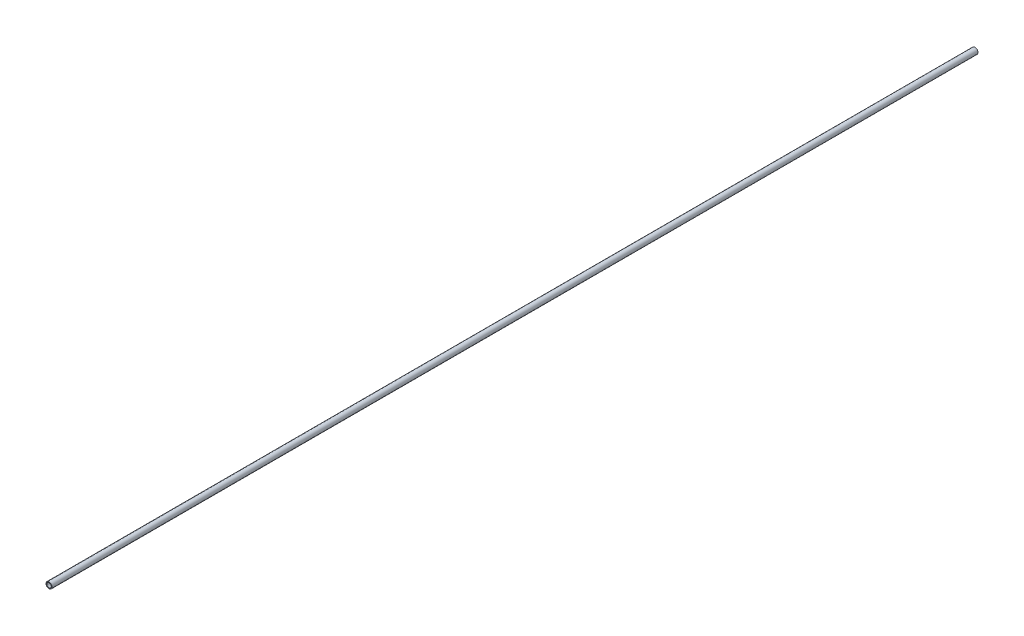
ISO-10303-21;
HEADER;
FILE_DESCRIPTION(('STEP AP214'),'2;1');
FILE_NAME('part.step','',(''),(''),'','','');
FILE_SCHEMA(('AUTOMOTIVE_DESIGN { 1 0 10303 214 1 1 1 1 }'));
ENDSEC;
DATA;
#1=APPLICATION_CONTEXT('core data for automotive mechanical design processes');
#2=APPLICATION_PROTOCOL_DEFINITION('international standard','automotive_design',2000,#1);
#3=PRODUCT_CONTEXT('',#1,'mechanical');
#4=PRODUCT('Part','Part','',(#3));
#5=PRODUCT_RELATED_PRODUCT_CATEGORY('part','',(#4));
#6=PRODUCT_DEFINITION_FORMATION('','',#4);
#7=PRODUCT_DEFINITION_CONTEXT('part definition',#1,'design');
#8=PRODUCT_DEFINITION('design','',#6,#7);
#9=PRODUCT_DEFINITION_SHAPE('','',#8);
#10=(LENGTH_UNIT() NAMED_UNIT(*) SI_UNIT(.MILLI.,.METRE.));
#11=(NAMED_UNIT(*) PLANE_ANGLE_UNIT() SI_UNIT($,.RADIAN.));
#12=(NAMED_UNIT(*) SI_UNIT($,.STERADIAN.) SOLID_ANGLE_UNIT());
#13=UNCERTAINTY_MEASURE_WITH_UNIT(LENGTH_MEASURE(1.E-05),#10,'distance_accuracy_value','');
#14=(GEOMETRIC_REPRESENTATION_CONTEXT(3) GLOBAL_UNCERTAINTY_ASSIGNED_CONTEXT((#13)) GLOBAL_UNIT_ASSIGNED_CONTEXT((#10,
#11,#12)) REPRESENTATION_CONTEXT('',''));
#15=CARTESIAN_POINT('',(0.,0.,0.));
#16=DIRECTION('',(0.,0.,1.));
#17=DIRECTION('',(1.,0.,0.));
#18=AXIS2_PLACEMENT_3D('',#15,#16,#17);
#19=CARTESIAN_POINT('',(0.,0.,1230.));
#20=DIRECTION('',(0.,0.,1.));
#21=DIRECTION('',(1.,0.,0.));
#22=AXIS2_PLACEMENT_3D('',#19,#20,#21);
#23=PLANE('',#22);
#24=CARTESIAN_POINT('',(0.,0.,1230.));
#25=DIRECTION('',(0.,0.,1.));
#26=DIRECTION('',(1.,0.,0.));
#27=AXIS2_PLACEMENT_3D('',#24,#25,#26);
#28=CIRCLE('',#27,4.);
#29=CARTESIAN_POINT('',(4.,0.,1230.));
#30=VERTEX_POINT('',#29);
#31=EDGE_CURVE('E10',#30,#30,#28,.T.);
#32=ORIENTED_EDGE('',*,*,#31,.T.);
#33=EDGE_LOOP('',(#32));
#34=FACE_BOUND('',#33,.T.);
#35=CARTESIAN_POINT('',(0.,0.,1230.));
#36=DIRECTION('',(0.,0.,1.));
#37=DIRECTION('',(1.,0.,0.));
#38=AXIS2_PLACEMENT_3D('',#35,#36,#37);
#39=CIRCLE('',#38,3.);
#40=CARTESIAN_POINT('',(3.,0.,1230.));
#41=VERTEX_POINT('',#40);
#42=EDGE_CURVE('E50',#41,#41,#39,.T.);
#43=ORIENTED_EDGE('',*,*,#42,.F.);
#44=EDGE_LOOP('',(#43));
#45=FACE_BOUND('',#44,.T.);
#46=ADVANCED_FACE('F39',(#34,#45),#23,.T.);
#47=CARTESIAN_POINT('',(0.,0.,0.));
#48=DIRECTION('',(0.,0.,1.));
#49=DIRECTION('',(1.,0.,0.));
#50=AXIS2_PLACEMENT_3D('',#47,#48,#49);
#51=PLANE('',#50);
#52=CARTESIAN_POINT('',(0.,0.,0.));
#53=DIRECTION('',(0.,0.,1.));
#54=DIRECTION('',(1.,0.,0.));
#55=AXIS2_PLACEMENT_3D('',#52,#53,#54);
#56=CIRCLE('',#55,4.);
#57=CARTESIAN_POINT('',(4.,0.,0.));
#58=VERTEX_POINT('',#57);
#59=EDGE_CURVE('E43',#58,#58,#56,.T.);
#60=ORIENTED_EDGE('',*,*,#59,.F.);
#61=EDGE_LOOP('',(#60));
#62=FACE_BOUND('',#61,.T.);
#63=CARTESIAN_POINT('',(0.,0.,0.));
#64=DIRECTION('',(0.,0.,1.));
#65=DIRECTION('',(1.,0.,0.));
#66=AXIS2_PLACEMENT_3D('',#63,#64,#65);
#67=CIRCLE('',#66,3.);
#68=CARTESIAN_POINT('',(3.,0.,0.));
#69=VERTEX_POINT('',#68);
#70=EDGE_CURVE('E52',#69,#69,#67,.T.);
#71=ORIENTED_EDGE('',*,*,#70,.T.);
#72=EDGE_LOOP('',(#71));
#73=FACE_BOUND('',#72,.T.);
#74=ADVANCED_FACE('F62',(#62,#73),#51,.F.);
#75=CARTESIAN_POINT('',(0.,0.,1230.));
#76=DIRECTION('',(0.,0.,-1.));
#77=DIRECTION('',(-1.,0.,0.));
#78=AXIS2_PLACEMENT_3D('',#75,#76,#77);
#79=CYLINDRICAL_SURFACE('',#78,4.);
#80=ORIENTED_EDGE('',*,*,#31,.F.);
#81=EDGE_LOOP('',(#80));
#82=FACE_BOUND('',#81,.T.);
#83=ORIENTED_EDGE('',*,*,#59,.T.);
#84=EDGE_LOOP('',(#83));
#85=FACE_BOUND('',#84,.T.);
#86=ADVANCED_FACE('F41',(#82,#85),#79,.T.);
#87=CARTESIAN_POINT('',(0.,0.,1230.));
#88=DIRECTION('',(0.,0.,-1.));
#89=DIRECTION('',(-1.,0.,0.));
#90=AXIS2_PLACEMENT_3D('',#87,#88,#89);
#91=CYLINDRICAL_SURFACE('',#90,3.);
#92=ORIENTED_EDGE('',*,*,#42,.T.);
#93=EDGE_LOOP('',(#92));
#94=FACE_BOUND('',#93,.T.);
#95=ORIENTED_EDGE('',*,*,#70,.F.);
#96=EDGE_LOOP('',(#95));
#97=FACE_BOUND('',#96,.T.);
#98=ADVANCED_FACE('F58',(#94,#97),#91,.F.);
#99=CLOSED_SHELL('',(#46,#74,#86,#98));
#100=MANIFOLD_SOLID_BREP('B2',#99);
#101=ADVANCED_BREP_SHAPE_REPRESENTATION('',(#18,#100),#14);
#102=SHAPE_DEFINITION_REPRESENTATION(#9,#101);
ENDSEC;
END-ISO-10303-21;
